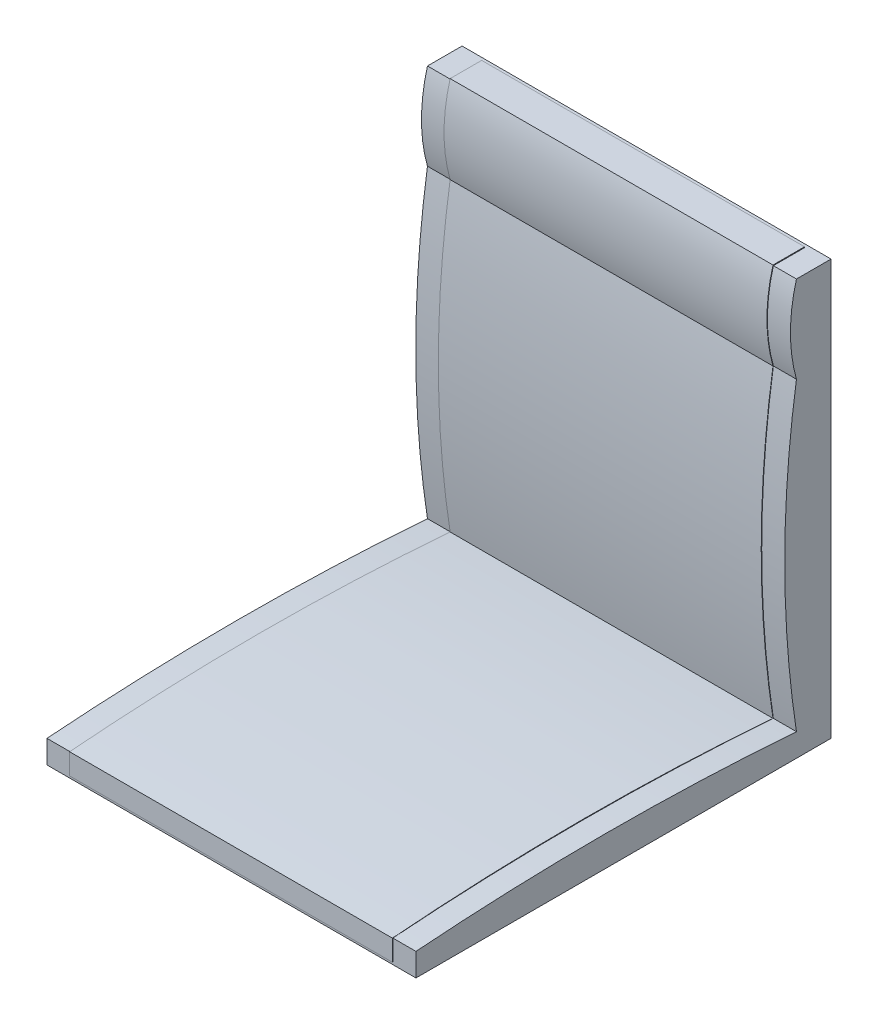
ISO-10303-21;
HEADER;
FILE_DESCRIPTION(('STEP AP214'),'2;1');
FILE_NAME('part.step','',(''),(''),'','','');
FILE_SCHEMA(('AUTOMOTIVE_DESIGN { 1 0 10303 214 1 1 1 1 }'));
ENDSEC;
DATA;
#1=APPLICATION_CONTEXT('core data for automotive mechanical design processes');
#2=APPLICATION_PROTOCOL_DEFINITION('international standard','automotive_design',2000,#1);
#3=PRODUCT_CONTEXT('',#1,'mechanical');
#4=PRODUCT('Part','Part','',(#3));
#5=PRODUCT_RELATED_PRODUCT_CATEGORY('part','',(#4));
#6=PRODUCT_DEFINITION_FORMATION('','',#4);
#7=PRODUCT_DEFINITION_CONTEXT('part definition',#1,'design');
#8=PRODUCT_DEFINITION('design','',#6,#7);
#9=PRODUCT_DEFINITION_SHAPE('','',#8);
#10=(LENGTH_UNIT() NAMED_UNIT(*) SI_UNIT(.MILLI.,.METRE.));
#11=(NAMED_UNIT(*) PLANE_ANGLE_UNIT() SI_UNIT($,.RADIAN.));
#12=(NAMED_UNIT(*) SI_UNIT($,.STERADIAN.) SOLID_ANGLE_UNIT());
#13=UNCERTAINTY_MEASURE_WITH_UNIT(LENGTH_MEASURE(1.E-05),#10,'distance_accuracy_value','');
#14=(GEOMETRIC_REPRESENTATION_CONTEXT(3) GLOBAL_UNCERTAINTY_ASSIGNED_CONTEXT((#13)) GLOBAL_UNIT_ASSIGNED_CONTEXT((#10,
#11,#12)) REPRESENTATION_CONTEXT('',''));
#15=CARTESIAN_POINT('',(0.,0.,0.));
#16=DIRECTION('',(0.,0.,1.));
#17=DIRECTION('',(1.,0.,0.));
#18=AXIS2_PLACEMENT_3D('',#15,#16,#17);
#19=CARTESIAN_POINT('',(0.,406.4,0.));
#20=DIRECTION('',(0.,-1.,0.));
#21=DIRECTION('',(0.,0.,-1.));
#22=AXIS2_PLACEMENT_3D('',#19,#20,#21);
#23=PLANE('',#22);
#24=DIRECTION('',(-1.,0.,0.));
#25=VECTOR('',#24,1.);
#26=CARTESIAN_POINT('',(-203.2,406.4,-228.6));
#27=LINE('',#26,#25);
#28=CARTESIAN_POINT('',(203.2,406.4,-228.6));
#29=VERTEX_POINT('',#28);
#30=CARTESIAN_POINT('',(-203.2,406.4,-228.6));
#31=VERTEX_POINT('',#30);
#32=EDGE_CURVE('E334',#29,#31,#27,.T.);
#33=ORIENTED_EDGE('',*,*,#32,.F.);
#34=DIRECTION('',(0.,0.,-1.));
#35=VECTOR('',#34,1.);
#36=CARTESIAN_POINT('',(203.2,406.4,228.6));
#37=LINE('',#36,#35);
#38=CARTESIAN_POINT('',(203.2,406.4,228.6));
#39=VERTEX_POINT('',#38);
#40=EDGE_CURVE('E324',#39,#29,#37,.T.);
#41=ORIENTED_EDGE('',*,*,#40,.F.);
#42=DIRECTION('',(1.,0.,0.));
#43=VECTOR('',#42,1.);
#44=CARTESIAN_POINT('',(-203.2,406.4,228.6));
#45=LINE('',#44,#43);
#46=CARTESIAN_POINT('',(-203.2,406.4,228.6));
#47=VERTEX_POINT('',#46);
#48=EDGE_CURVE('E339',#47,#39,#45,.T.);
#49=ORIENTED_EDGE('',*,*,#48,.F.);
#50=DIRECTION('',(0.,0.,1.));
#51=VECTOR('',#50,1.);
#52=CARTESIAN_POINT('',(-203.2,406.4,228.6));
#53=LINE('',#52,#51);
#54=EDGE_CURVE('E337',#31,#47,#53,.T.);
#55=ORIENTED_EDGE('',*,*,#54,.F.);
#56=EDGE_LOOP('',(#33,#41,#49,#55));
#57=FACE_BOUND('',#56,.T.);
#58=DIRECTION('',(0.,0.,1.));
#59=VECTOR('',#58,1.);
#60=CARTESIAN_POINT('',(0.,406.4,0.));
#61=LINE('',#60,#59);
#62=CARTESIAN_POINT('',(0.,406.4,0.));
#63=VERTEX_POINT('',#62);
#64=CARTESIAN_POINT('',(0.,406.4,1.93196020637743));
#65=VERTEX_POINT('',#64);
#66=EDGE_CURVE('E705',#63,#65,#61,.T.);
#67=ORIENTED_EDGE('',*,*,#66,.F.);
#68=DIRECTION('',(1.,0.,0.));
#69=VECTOR('',#68,1.);
#70=CARTESIAN_POINT('',(-1.33102062761736,406.4,0.));
#71=LINE('',#70,#69);
#72=CARTESIAN_POINT('',(-1.33102062761736,406.4,0.));
#73=VERTEX_POINT('',#72);
#74=EDGE_CURVE('E216',#73,#63,#71,.T.);
#75=ORIENTED_EDGE('',*,*,#74,.F.);
#76=DIRECTION('',(-0.567338393542588,0.,-0.823484758336495));
#77=VECTOR('',#76,1.);
#78=CARTESIAN_POINT('',(0.,406.4,1.93196020637743));
#79=LINE('',#78,#77);
#80=EDGE_CURVE('E212',#65,#73,#79,.T.);
#81=ORIENTED_EDGE('',*,*,#80,.F.);
#82=EDGE_LOOP('',(#67,#75,#81));
#83=FACE_BOUND('',#82,.T.);
#84=ADVANCED_FACE('F50',(#57,#83),#23,.T.);
#85=CARTESIAN_POINT('',(-203.2,599.893069022727,-1283.6487688182));
#86=DIRECTION('',(1.,0.,0.));
#87=DIRECTION('',(0.,0.,-1.));
#88=AXIS2_PLACEMENT_3D('',#85,#86,#87);
#89=CYLINDRICAL_SURFACE('',#88,1105.99706628102);
#90=DIRECTION('',(1.,0.,0.));
#91=VECTOR('',#90,1.);
#92=CARTESIAN_POINT('',(-203.2,767.986138045453,-190.5));
#93=LINE('',#92,#91);
#94=CARTESIAN_POINT('',(177.8,767.986138045453,-190.5));
#95=VERTEX_POINT('',#94);
#96=CARTESIAN_POINT('',(203.2,767.986138045453,-190.5));
#97=VERTEX_POINT('',#96);
#98=EDGE_CURVE('E305',#95,#97,#93,.T.);
#99=ORIENTED_EDGE('',*,*,#98,.F.);
#100=CARTESIAN_POINT('',(177.8,599.893069022727,-1283.6487688182));
#101=DIRECTION('',(-1.,0.,0.));
#102=DIRECTION('',(0.,0.,1.));
#103=AXIS2_PLACEMENT_3D('',#100,#101,#102);
#104=CIRCLE('',#103,1105.99706628102);
#105=CARTESIAN_POINT('',(177.8,431.8,-190.5));
#106=VERTEX_POINT('',#105);
#107=EDGE_CURVE('E73',#95,#106,#104,.F.);
#108=ORIENTED_EDGE('',*,*,#107,.T.);
#109=DIRECTION('',(1.,0.,0.));
#110=VECTOR('',#109,1.);
#111=CARTESIAN_POINT('',(-203.2,431.8,-190.5));
#112=LINE('',#111,#110);
#113=CARTESIAN_POINT('',(203.2,431.8,-190.5));
#114=VERTEX_POINT('',#113);
#115=EDGE_CURVE('E311',#106,#114,#112,.T.);
#116=ORIENTED_EDGE('',*,*,#115,.T.);
#117=CARTESIAN_POINT('',(203.2,599.893069022727,-1283.6487688182));
#118=DIRECTION('',(1.,0.,0.));
#119=DIRECTION('',(0.,0.,-1.));
#120=AXIS2_PLACEMENT_3D('',#117,#118,#119);
#121=CIRCLE('',#120,1105.99706628102);
#122=EDGE_CURVE('E299',#97,#114,#121,.T.);
#123=ORIENTED_EDGE('',*,*,#122,.F.);
#124=EDGE_LOOP('',(#99,#108,#116,#123));
#125=FACE_BOUND('',#124,.T.);
#126=ADVANCED_FACE('F381',(#125),#89,.T.);
#127=CARTESIAN_POINT('',(-203.2,-2322.38845195721,19.0500000000001));
#128=DIRECTION('',(1.,0.,0.));
#129=DIRECTION('',(0.,0.,-1.));
#130=AXIS2_PLACEMENT_3D('',#127,#128,#129);
#131=CYLINDRICAL_SURFACE('',#130,2762.1486620735);
#132=ORIENTED_EDGE('',*,*,#115,.F.);
#133=CARTESIAN_POINT('',(177.8,-2322.38845195721,19.0500000000001));
#134=DIRECTION('',(-1.,0.,0.));
#135=DIRECTION('',(0.,0.,1.));
#136=AXIS2_PLACEMENT_3D('',#133,#134,#135);
#137=CIRCLE('',#136,2762.1486620735);
#138=CARTESIAN_POINT('',(177.8,431.8,228.6));
#139=VERTEX_POINT('',#138);
#140=EDGE_CURVE('E276',#106,#139,#137,.F.);
#141=ORIENTED_EDGE('',*,*,#140,.T.);
#142=DIRECTION('',(1.,0.,0.));
#143=VECTOR('',#142,1.);
#144=CARTESIAN_POINT('',(-203.2,431.8,228.6));
#145=LINE('',#144,#143);
#146=CARTESIAN_POINT('',(203.2,431.8,228.6));
#147=VERTEX_POINT('',#146);
#148=EDGE_CURVE('E331',#139,#147,#145,.T.);
#149=ORIENTED_EDGE('',*,*,#148,.T.);
#150=CARTESIAN_POINT('',(203.2,-2322.38845195721,19.0500000000001));
#151=DIRECTION('',(1.,0.,0.));
#152=DIRECTION('',(0.,0.,1.));
#153=AXIS2_PLACEMENT_3D('',#150,#151,#152);
#154=CIRCLE('',#153,2762.1486620735);
#155=EDGE_CURVE('E294',#114,#147,#154,.T.);
#156=ORIENTED_EDGE('',*,*,#155,.F.);
#157=EDGE_LOOP('',(#132,#141,#149,#156));
#158=FACE_BOUND('',#157,.T.);
#159=ADVANCED_FACE('F446',(#158),#131,.T.);
#160=CARTESIAN_POINT('',(-203.2,815.793069022726,-360.231275794569));
#161=DIRECTION('',(1.,0.,0.));
#162=DIRECTION('',(0.,0.,-1.));
#163=AXIS2_PLACEMENT_3D('',#160,#161,#162);
#164=CYLINDRICAL_SURFACE('',#163,176.335500204349);
#165=DIRECTION('',(1.,0.,0.));
#166=VECTOR('',#165,1.);
#167=CARTESIAN_POINT('',(-203.2,863.6,-190.5));
#168=LINE('',#167,#166);
#169=CARTESIAN_POINT('',(177.8,863.6,-190.5));
#170=VERTEX_POINT('',#169);
#171=CARTESIAN_POINT('',(203.2,863.6,-190.5));
#172=VERTEX_POINT('',#171);
#173=EDGE_CURVE('E314',#170,#172,#168,.T.);
#174=ORIENTED_EDGE('',*,*,#173,.F.);
#175=CARTESIAN_POINT('',(177.8,815.793069022726,-360.231275794569));
#176=DIRECTION('',(-1.,0.,0.));
#177=DIRECTION('',(0.,0.,1.));
#178=AXIS2_PLACEMENT_3D('',#175,#176,#177);
#179=CIRCLE('',#178,176.335500204349);
#180=EDGE_CURVE('E350',#170,#95,#179,.F.);
#181=ORIENTED_EDGE('',*,*,#180,.T.);
#182=ORIENTED_EDGE('',*,*,#98,.T.);
#183=CARTESIAN_POINT('',(203.2,815.793069022726,-360.231275794569));
#184=DIRECTION('',(1.,0.,0.));
#185=DIRECTION('',(0.,0.,1.));
#186=AXIS2_PLACEMENT_3D('',#183,#184,#185);
#187=CIRCLE('',#186,176.335500204349);
#188=EDGE_CURVE('E290',#172,#97,#187,.T.);
#189=ORIENTED_EDGE('',*,*,#188,.F.);
#190=EDGE_LOOP('',(#174,#181,#182,#189));
#191=FACE_BOUND('',#190,.T.);
#192=ADVANCED_FACE('F377',(#191),#164,.T.);
#193=CARTESIAN_POINT('',(203.2,431.8,228.6));
#194=DIRECTION('',(-1.,0.,0.));
#195=DIRECTION('',(0.,0.,1.));
#196=AXIS2_PLACEMENT_3D('',#193,#194,#195);
#197=PLANE('',#196);
#198=ORIENTED_EDGE('',*,*,#40,.T.);
#199=DIRECTION('',(0.,-1.,0.));
#200=VECTOR('',#199,1.);
#201=CARTESIAN_POINT('',(203.2,431.8,-228.6));
#202=LINE('',#201,#200);
#203=CARTESIAN_POINT('',(203.2,863.6,-228.6));
#204=VERTEX_POINT('',#203);
#205=EDGE_CURVE('E348',#204,#29,#202,.T.);
#206=ORIENTED_EDGE('',*,*,#205,.F.);
#207=DIRECTION('',(0.,0.,-1.));
#208=VECTOR('',#207,1.);
#209=CARTESIAN_POINT('',(203.2,863.6,-228.6));
#210=LINE('',#209,#208);
#211=EDGE_CURVE('E319',#172,#204,#210,.T.);
#212=ORIENTED_EDGE('',*,*,#211,.F.);
#213=ORIENTED_EDGE('',*,*,#188,.T.);
#214=ORIENTED_EDGE('',*,*,#122,.T.);
#215=ORIENTED_EDGE('',*,*,#155,.T.);
#216=DIRECTION('',(0.,-1.,0.));
#217=VECTOR('',#216,1.);
#218=CARTESIAN_POINT('',(203.2,431.8,228.6));
#219=LINE('',#218,#217);
#220=EDGE_CURVE('E330',#147,#39,#219,.T.);
#221=ORIENTED_EDGE('',*,*,#220,.T.);
#222=EDGE_LOOP('',(#198,#206,#212,#213,#214,#215,#221));
#223=FACE_BOUND('',#222,.T.);
#224=ADVANCED_FACE('F52',(#223),#197,.F.);
#225=CARTESIAN_POINT('',(-203.2,431.8,-228.6));
#226=DIRECTION('',(0.,0.,1.));
#227=DIRECTION('',(1.,0.,0.));
#228=AXIS2_PLACEMENT_3D('',#225,#226,#227);
#229=PLANE('',#228);
#230=ORIENTED_EDGE('',*,*,#32,.T.);
#231=DIRECTION('',(0.,-1.,0.));
#232=VECTOR('',#231,1.);
#233=CARTESIAN_POINT('',(-203.2,431.8,-228.6));
#234=LINE('',#233,#232);
#235=CARTESIAN_POINT('',(-203.2,863.6,-228.6));
#236=VERTEX_POINT('',#235);
#237=EDGE_CURVE('E346',#236,#31,#234,.T.);
#238=ORIENTED_EDGE('',*,*,#237,.F.);
#239=DIRECTION('',(-1.,0.,0.));
#240=VECTOR('',#239,1.);
#241=CARTESIAN_POINT('',(-203.2,863.6,-228.6));
#242=LINE('',#241,#240);
#243=EDGE_CURVE('E321',#204,#236,#242,.T.);
#244=ORIENTED_EDGE('',*,*,#243,.F.);
#245=ORIENTED_EDGE('',*,*,#205,.T.);
#246=EDGE_LOOP('',(#230,#238,#244,#245));
#247=FACE_BOUND('',#246,.T.);
#248=ADVANCED_FACE('F455',(#247),#229,.F.);
#249=CARTESIAN_POINT('',(-203.2,431.8,228.6));
#250=DIRECTION('',(1.,0.,0.));
#251=DIRECTION('',(0.,0.,-1.));
#252=AXIS2_PLACEMENT_3D('',#249,#250,#251);
#253=PLANE('',#252);
#254=CARTESIAN_POINT('',(-203.2,599.893069022727,-1283.6487688182));
#255=DIRECTION('',(1.,0.,0.));
#256=DIRECTION('',(0.,0.,-1.));
#257=AXIS2_PLACEMENT_3D('',#254,#255,#256);
#258=CIRCLE('',#257,1105.99706628102);
#259=CARTESIAN_POINT('',(-203.2,767.986138045453,-190.5));
#260=VERTEX_POINT('',#259);
#261=CARTESIAN_POINT('',(-203.2,431.8,-190.5));
#262=VERTEX_POINT('',#261);
#263=EDGE_CURVE('E302',#260,#262,#258,.T.);
#264=ORIENTED_EDGE('',*,*,#263,.F.);
#265=CARTESIAN_POINT('',(-203.2,815.793069022726,-360.231275794569));
#266=DIRECTION('',(1.,0.,0.));
#267=DIRECTION('',(0.,0.,1.));
#268=AXIS2_PLACEMENT_3D('',#265,#266,#267);
#269=CIRCLE('',#268,176.335500204349);
#270=CARTESIAN_POINT('',(-203.2,863.6,-190.5));
#271=VERTEX_POINT('',#270);
#272=EDGE_CURVE('E291',#271,#260,#269,.T.);
#273=ORIENTED_EDGE('',*,*,#272,.F.);
#274=DIRECTION('',(0.,0.,1.));
#275=VECTOR('',#274,1.);
#276=CARTESIAN_POINT('',(-203.2,863.6,-228.6));
#277=LINE('',#276,#275);
#278=EDGE_CURVE('E312',#236,#271,#277,.T.);
#279=ORIENTED_EDGE('',*,*,#278,.F.);
#280=ORIENTED_EDGE('',*,*,#237,.T.);
#281=ORIENTED_EDGE('',*,*,#54,.T.);
#282=DIRECTION('',(0.,-1.,0.));
#283=VECTOR('',#282,1.);
#284=CARTESIAN_POINT('',(-203.2,431.8,228.6));
#285=LINE('',#284,#283);
#286=CARTESIAN_POINT('',(-203.2,431.8,228.6));
#287=VERTEX_POINT('',#286);
#288=EDGE_CURVE('E343',#287,#47,#285,.T.);
#289=ORIENTED_EDGE('',*,*,#288,.F.);
#290=CARTESIAN_POINT('',(-203.2,-2322.38845195721,19.0500000000001));
#291=DIRECTION('',(1.,0.,0.));
#292=DIRECTION('',(0.,0.,1.));
#293=AXIS2_PLACEMENT_3D('',#290,#291,#292);
#294=CIRCLE('',#293,2762.1486620735);
#295=EDGE_CURVE('E297',#262,#287,#294,.T.);
#296=ORIENTED_EDGE('',*,*,#295,.F.);
#297=EDGE_LOOP('',(#264,#273,#279,#280,#281,#289,#296));
#298=FACE_BOUND('',#297,.T.);
#299=ADVANCED_FACE('F394',(#298),#253,.F.);
#300=CARTESIAN_POINT('',(-203.2,431.8,228.6));
#301=DIRECTION('',(0.,0.,-1.));
#302=DIRECTION('',(-1.,0.,0.));
#303=AXIS2_PLACEMENT_3D('',#300,#301,#302);
#304=PLANE('',#303);
#305=DIRECTION('',(1.,0.,0.));
#306=VECTOR('',#305,1.);
#307=CARTESIAN_POINT('',(-203.2,408.976479820344,228.6));
#308=LINE('',#307,#306);
#309=CARTESIAN_POINT('',(-177.8,408.976479820344,228.6));
#310=VERTEX_POINT('',#309);
#311=CARTESIAN_POINT('',(177.8,408.976479820344,228.6));
#312=VERTEX_POINT('',#311);
#313=EDGE_CURVE('E13',#310,#312,#308,.T.);
#314=ORIENTED_EDGE('',*,*,#313,.F.);
#315=DIRECTION('',(0.,1.,0.));
#316=VECTOR('',#315,1.);
#317=CARTESIAN_POINT('',(-177.8,431.8,228.6));
#318=LINE('',#317,#316);
#319=CARTESIAN_POINT('',(-177.8,431.8,228.6));
#320=VERTEX_POINT('',#319);
#321=EDGE_CURVE('E287',#310,#320,#318,.T.);
#322=ORIENTED_EDGE('',*,*,#321,.T.);
#323=EDGE_CURVE('E327',#287,#320,#145,.T.);
#324=ORIENTED_EDGE('',*,*,#323,.F.);
#325=ORIENTED_EDGE('',*,*,#288,.T.);
#326=ORIENTED_EDGE('',*,*,#48,.T.);
#327=ORIENTED_EDGE('',*,*,#220,.F.);
#328=ORIENTED_EDGE('',*,*,#148,.F.);
#329=DIRECTION('',(0.,1.,0.));
#330=VECTOR('',#329,1.);
#331=CARTESIAN_POINT('',(177.8,431.8,228.6));
#332=LINE('',#331,#330);
#333=EDGE_CURVE('E279',#312,#139,#332,.T.);
#334=ORIENTED_EDGE('',*,*,#333,.F.);
#335=EDGE_LOOP('',(#314,#322,#324,#325,#326,#327,#328,#334));
#336=FACE_BOUND('',#335,.T.);
#337=ADVANCED_FACE('F410',(#336),#304,.F.);
#338=CARTESIAN_POINT('',(0.,863.6,0.));
#339=DIRECTION('',(0.,1.,0.));
#340=DIRECTION('',(0.,0.,1.));
#341=AXIS2_PLACEMENT_3D('',#338,#339,#340);
#342=PLANE('',#341);
#343=DIRECTION('',(0.,0.,1.));
#344=VECTOR('',#343,1.);
#345=CARTESIAN_POINT('',(-177.8,863.6,0.));
#346=LINE('',#345,#344);
#347=CARTESIAN_POINT('',(-177.8,863.6,-224.793246744636));
#348=VERTEX_POINT('',#347);
#349=CARTESIAN_POINT('',(-177.8,863.6,-190.5));
#350=VERTEX_POINT('',#349);
#351=EDGE_CURVE('E283',#348,#350,#346,.T.);
#352=ORIENTED_EDGE('',*,*,#351,.F.);
#353=DIRECTION('',(1.,0.,0.));
#354=VECTOR('',#353,1.);
#355=CARTESIAN_POINT('',(0.,863.6,-224.793246744636));
#356=LINE('',#355,#354);
#357=CARTESIAN_POINT('',(177.8,863.6,-224.793246744636));
#358=VERTEX_POINT('',#357);
#359=EDGE_CURVE('E58',#348,#358,#356,.T.);
#360=ORIENTED_EDGE('',*,*,#359,.T.);
#361=DIRECTION('',(0.,0.,1.));
#362=VECTOR('',#361,1.);
#363=CARTESIAN_POINT('',(177.8,863.6,0.));
#364=LINE('',#363,#362);
#365=EDGE_CURVE('E273',#358,#170,#364,.T.);
#366=ORIENTED_EDGE('',*,*,#365,.T.);
#367=ORIENTED_EDGE('',*,*,#173,.T.);
#368=ORIENTED_EDGE('',*,*,#211,.T.);
#369=ORIENTED_EDGE('',*,*,#243,.T.);
#370=ORIENTED_EDGE('',*,*,#278,.T.);
#371=EDGE_CURVE('E316',#271,#350,#168,.T.);
#372=ORIENTED_EDGE('',*,*,#371,.T.);
#373=EDGE_LOOP('',(#352,#360,#366,#367,#368,#369,#370,#372));
#374=FACE_BOUND('',#373,.T.);
#375=ADVANCED_FACE('F356',(#374),#342,.T.);
#376=CARTESIAN_POINT('',(-177.8,599.893069022727,-1283.6487688182));
#377=DIRECTION('',(-1.,0.,0.));
#378=DIRECTION('',(0.,0.,1.));
#379=AXIS2_PLACEMENT_3D('',#376,#377,#378);
#380=CIRCLE('',#379,1105.99706628102);
#381=CARTESIAN_POINT('',(-177.8,767.986138045453,-190.5));
#382=VERTEX_POINT('',#381);
#383=CARTESIAN_POINT('',(-177.8,431.8,-190.5));
#384=VERTEX_POINT('',#383);
#385=EDGE_CURVE('E281',#382,#384,#380,.F.);
#386=ORIENTED_EDGE('',*,*,#385,.F.);
#387=EDGE_CURVE('E308',#260,#382,#93,.T.);
#388=ORIENTED_EDGE('',*,*,#387,.F.);
#389=ORIENTED_EDGE('',*,*,#263,.T.);
#390=EDGE_CURVE('E315',#262,#384,#112,.T.);
#391=ORIENTED_EDGE('',*,*,#390,.T.);
#392=EDGE_LOOP('',(#386,#388,#389,#391));
#393=FACE_BOUND('',#392,.T.);
#394=ADVANCED_FACE('F401',(#393),#89,.T.);
#395=CARTESIAN_POINT('',(-177.8,-2322.38845195721,19.0500000000001));
#396=DIRECTION('',(-1.,0.,0.));
#397=DIRECTION('',(0.,0.,1.));
#398=AXIS2_PLACEMENT_3D('',#395,#396,#397);
#399=CIRCLE('',#398,2762.1486620735);
#400=EDGE_CURVE('E285',#384,#320,#399,.F.);
#401=ORIENTED_EDGE('',*,*,#400,.F.);
#402=ORIENTED_EDGE('',*,*,#390,.F.);
#403=ORIENTED_EDGE('',*,*,#295,.T.);
#404=ORIENTED_EDGE('',*,*,#323,.T.);
#405=EDGE_LOOP('',(#401,#402,#403,#404));
#406=FACE_BOUND('',#405,.T.);
#407=ADVANCED_FACE('F403',(#406),#131,.T.);
#408=CARTESIAN_POINT('',(-177.8,815.793069022726,-360.231275794569));
#409=DIRECTION('',(-1.,0.,0.));
#410=DIRECTION('',(0.,0.,1.));
#411=AXIS2_PLACEMENT_3D('',#408,#409,#410);
#412=CIRCLE('',#411,176.335500204349);
#413=EDGE_CURVE('E352',#350,#382,#412,.F.);
#414=ORIENTED_EDGE('',*,*,#413,.F.);
#415=ORIENTED_EDGE('',*,*,#371,.F.);
#416=ORIENTED_EDGE('',*,*,#272,.T.);
#417=ORIENTED_EDGE('',*,*,#387,.T.);
#418=EDGE_LOOP('',(#414,#415,#416,#417));
#419=FACE_BOUND('',#418,.T.);
#420=ADVANCED_FACE('F397',(#419),#164,.T.);
#421=CARTESIAN_POINT('',(-177.8,408.976479820344,-224.793246744636));
#422=DIRECTION('',(0.,1.,0.));
#423=DIRECTION('',(0.,0.,1.));
#424=AXIS2_PLACEMENT_3D('',#421,#422,#423);
#425=PLANE('',#424);
#426=DIRECTION('',(0.,0.,1.));
#427=VECTOR('',#426,1.);
#428=CARTESIAN_POINT('',(-177.8,408.976479820344,-224.793246744636));
#429=LINE('',#428,#427);
#430=CARTESIAN_POINT('',(-177.8,408.976479820344,229.126005902308));
#431=VERTEX_POINT('',#430);
#432=EDGE_CURVE('E230',#310,#431,#429,.T.);
#433=ORIENTED_EDGE('',*,*,#432,.F.);
#434=ORIENTED_EDGE('',*,*,#313,.T.);
#435=DIRECTION('',(0.,0.,1.));
#436=VECTOR('',#435,1.);
#437=CARTESIAN_POINT('',(177.8,408.976479820344,-224.793246744636));
#438=LINE('',#437,#436);
#439=CARTESIAN_POINT('',(177.8,408.976479820344,229.126005902308));
#440=VERTEX_POINT('',#439);
#441=EDGE_CURVE('E221',#312,#440,#438,.T.);
#442=ORIENTED_EDGE('',*,*,#441,.T.);
#443=DIRECTION('',(1.,0.,0.));
#444=VECTOR('',#443,1.);
#445=CARTESIAN_POINT('',(-177.8,408.976479820344,229.126005902308));
#446=LINE('',#445,#444);
#447=EDGE_CURVE('E269',#431,#440,#446,.T.);
#448=ORIENTED_EDGE('',*,*,#447,.F.);
#449=EDGE_LOOP('',(#433,#434,#442,#448));
#450=FACE_BOUND('',#449,.T.);
#451=ADVANCED_FACE('F415',(#450),#425,.F.);
#452=CARTESIAN_POINT('',(-177.8,-2169.09699587393,19.5307423923426));
#453=DIRECTION('',(-1.,0.,0.));
#454=DIRECTION('',(0.,0.,1.));
#455=AXIS2_PLACEMENT_3D('',#452,#453,#454);
#456=PLANE('',#455);
#457=ORIENTED_EDGE('',*,*,#321,.F.);
#458=ORIENTED_EDGE('',*,*,#432,.T.);
#459=DIRECTION('',(0.,1.,0.));
#460=VECTOR('',#459,1.);
#461=CARTESIAN_POINT('',(-177.8,408.976479820344,229.126005902308));
#462=LINE('',#461,#460);
#463=CARTESIAN_POINT('',(-177.8,432.005066031621,229.126005902308));
#464=VERTEX_POINT('',#463);
#465=EDGE_CURVE('E233',#431,#464,#462,.T.);
#466=ORIENTED_EDGE('',*,*,#465,.T.);
#467=CARTESIAN_POINT('',(-177.8,-2169.09699587393,19.5307423923426));
#468=DIRECTION('',(-1.,0.,0.));
#469=DIRECTION('',(0.,0.,1.));
#470=AXIS2_PLACEMENT_3D('',#467,#468,#469);
#471=CIRCLE('',#470,2609.53292965142);
#472=CARTESIAN_POINT('',(-177.8,432.005066031621,-190.064521117623));
#473=VERTEX_POINT('',#472);
#474=EDGE_CURVE('E235',#464,#473,#471,.T.);
#475=ORIENTED_EDGE('',*,*,#474,.T.);
#476=CARTESIAN_POINT('',(-177.8,600.056508720752,-1271.92044683431));
#477=DIRECTION('',(-1.,0.,0.));
#478=DIRECTION('',(0.,0.,1.));
#479=AXIS2_PLACEMENT_3D('',#476,#477,#478);
#480=CIRCLE('',#479,1094.83036649438);
#481=CARTESIAN_POINT('',(-177.8,768.107951409883,-190.064521117623));
#482=VERTEX_POINT('',#481);
#483=EDGE_CURVE('E237',#473,#482,#480,.T.);
#484=ORIENTED_EDGE('',*,*,#483,.T.);
#485=CARTESIAN_POINT('',(-177.8,816.295948050964,-360.239749299661));
#486=DIRECTION('',(-1.,0.,0.));
#487=DIRECTION('',(0.,0.,1.));
#488=AXIS2_PLACEMENT_3D('',#485,#486,#487);
#489=CIRCLE('',#488,176.866309135147);
#490=CARTESIAN_POINT('',(-177.8,864.483944692044,-190.064521117623));
#491=VERTEX_POINT('',#490);
#492=EDGE_CURVE('E239',#482,#491,#489,.T.);
#493=ORIENTED_EDGE('',*,*,#492,.T.);
#494=DIRECTION('',(0.,0.,-1.));
#495=VECTOR('',#494,1.);
#496=CARTESIAN_POINT('',(-177.8,864.483944692044,-190.064521117623));
#497=LINE('',#496,#495);
#498=CARTESIAN_POINT('',(-177.8,864.483944692044,-224.793246744636));
#499=VERTEX_POINT('',#498);
#500=EDGE_CURVE('E241',#491,#499,#497,.T.);
#501=ORIENTED_EDGE('',*,*,#500,.T.);
#502=DIRECTION('',(0.,-1.,0.));
#503=VECTOR('',#502,1.);
#504=CARTESIAN_POINT('',(-177.8,864.483944692044,-224.793246744636));
#505=LINE('',#504,#503);
#506=EDGE_CURVE('E227',#499,#348,#505,.T.);
#507=ORIENTED_EDGE('',*,*,#506,.T.);
#508=ORIENTED_EDGE('',*,*,#351,.T.);
#509=ORIENTED_EDGE('',*,*,#413,.T.);
#510=ORIENTED_EDGE('',*,*,#385,.T.);
#511=ORIENTED_EDGE('',*,*,#400,.T.);
#512=EDGE_LOOP('',(#457,#458,#466,#475,#484,#493,#501,#507,#508,#509,#510,#511));
#513=FACE_BOUND('',#512,.T.);
#514=ADVANCED_FACE('F362',(#513),#456,.T.);
#515=CARTESIAN_POINT('',(177.8,-2169.09699587393,19.5307423923426));
#516=DIRECTION('',(-1.,0.,0.));
#517=DIRECTION('',(0.,0.,1.));
#518=AXIS2_PLACEMENT_3D('',#515,#516,#517);
#519=PLANE('',#518);
#520=ORIENTED_EDGE('',*,*,#441,.F.);
#521=ORIENTED_EDGE('',*,*,#333,.T.);
#522=ORIENTED_EDGE('',*,*,#140,.F.);
#523=ORIENTED_EDGE('',*,*,#107,.F.);
#524=ORIENTED_EDGE('',*,*,#180,.F.);
#525=ORIENTED_EDGE('',*,*,#365,.F.);
#526=DIRECTION('',(0.,-1.,0.));
#527=VECTOR('',#526,1.);
#528=CARTESIAN_POINT('',(177.8,863.6,-224.793246744636));
#529=LINE('',#528,#527);
#530=CARTESIAN_POINT('',(177.8,864.483944692044,-224.793246744636));
#531=VERTEX_POINT('',#530);
#532=EDGE_CURVE('E218',#531,#358,#529,.T.);
#533=ORIENTED_EDGE('',*,*,#532,.F.);
#534=DIRECTION('',(0.,0.,-1.));
#535=VECTOR('',#534,1.);
#536=CARTESIAN_POINT('',(177.8,864.483944692044,-190.064521117623));
#537=LINE('',#536,#535);
#538=CARTESIAN_POINT('',(177.8,864.483944692044,-190.064521117623));
#539=VERTEX_POINT('',#538);
#540=EDGE_CURVE('E231',#539,#531,#537,.T.);
#541=ORIENTED_EDGE('',*,*,#540,.F.);
#542=CARTESIAN_POINT('',(177.8,816.295948050964,-360.239749299661));
#543=DIRECTION('',(-1.,0.,0.));
#544=DIRECTION('',(0.,0.,1.));
#545=AXIS2_PLACEMENT_3D('',#542,#543,#544);
#546=CIRCLE('',#545,176.866309135147);
#547=CARTESIAN_POINT('',(177.8,768.107951409883,-190.064521117623));
#548=VERTEX_POINT('',#547);
#549=EDGE_CURVE('E251',#548,#539,#546,.T.);
#550=ORIENTED_EDGE('',*,*,#549,.F.);
#551=CARTESIAN_POINT('',(177.8,600.056508720752,-1271.92044683431));
#552=DIRECTION('',(-1.,0.,0.));
#553=DIRECTION('',(0.,0.,1.));
#554=AXIS2_PLACEMENT_3D('',#551,#552,#553);
#555=CIRCLE('',#554,1094.83036649438);
#556=CARTESIAN_POINT('',(177.8,432.005066031621,-190.064521117623));
#557=VERTEX_POINT('',#556);
#558=EDGE_CURVE('E249',#557,#548,#555,.T.);
#559=ORIENTED_EDGE('',*,*,#558,.F.);
#560=CARTESIAN_POINT('',(177.8,-2169.09699587393,19.5307423923426));
#561=DIRECTION('',(-1.,0.,0.));
#562=DIRECTION('',(0.,0.,1.));
#563=AXIS2_PLACEMENT_3D('',#560,#561,#562);
#564=CIRCLE('',#563,2609.53292965142);
#565=CARTESIAN_POINT('',(177.8,432.005066031621,229.126005902308));
#566=VERTEX_POINT('',#565);
#567=EDGE_CURVE('E247',#566,#557,#564,.T.);
#568=ORIENTED_EDGE('',*,*,#567,.F.);
#569=DIRECTION('',(0.,1.,0.));
#570=VECTOR('',#569,1.);
#571=CARTESIAN_POINT('',(177.8,408.976479820344,229.126005902308));
#572=LINE('',#571,#570);
#573=EDGE_CURVE('E245',#440,#566,#572,.T.);
#574=ORIENTED_EDGE('',*,*,#573,.F.);
#575=EDGE_LOOP('',(#520,#521,#522,#523,#524,#525,#533,#541,#550,#559,#568,#574));
#576=FACE_BOUND('',#575,.T.);
#577=ADVANCED_FACE('F373',(#576),#519,.F.);
#578=CARTESIAN_POINT('',(-177.8,863.6,-224.793246744636));
#579=DIRECTION('',(0.,0.,1.));
#580=DIRECTION('',(1.,0.,0.));
#581=AXIS2_PLACEMENT_3D('',#578,#579,#580);
#582=PLANE('',#581);
#583=ORIENTED_EDGE('',*,*,#359,.F.);
#584=ORIENTED_EDGE('',*,*,#506,.F.);
#585=DIRECTION('',(1.,0.,0.));
#586=VECTOR('',#585,1.);
#587=CARTESIAN_POINT('',(-177.8,864.483944692044,-224.793246744636));
#588=LINE('',#587,#586);
#589=EDGE_CURVE('E242',#499,#531,#588,.T.);
#590=ORIENTED_EDGE('',*,*,#589,.T.);
#591=ORIENTED_EDGE('',*,*,#532,.T.);
#592=EDGE_LOOP('',(#583,#584,#590,#591));
#593=FACE_BOUND('',#592,.T.);
#594=ADVANCED_FACE('F360',(#593),#582,.F.);
#595=CARTESIAN_POINT('',(-177.8,408.976479820344,229.126005902308));
#596=DIRECTION('',(0.,0.,-1.));
#597=DIRECTION('',(-1.,0.,0.));
#598=AXIS2_PLACEMENT_3D('',#595,#596,#597);
#599=PLANE('',#598);
#600=ORIENTED_EDGE('',*,*,#573,.T.);
#601=DIRECTION('',(1.,0.,0.));
#602=VECTOR('',#601,1.);
#603=CARTESIAN_POINT('',(-177.8,432.005066031621,229.126005902308));
#604=LINE('',#603,#602);
#605=EDGE_CURVE('E266',#464,#566,#604,.T.);
#606=ORIENTED_EDGE('',*,*,#605,.F.);
#607=ORIENTED_EDGE('',*,*,#465,.F.);
#608=ORIENTED_EDGE('',*,*,#447,.T.);
#609=EDGE_LOOP('',(#600,#606,#607,#608));
#610=FACE_BOUND('',#609,.T.);
#611=ADVANCED_FACE('F420',(#610),#599,.F.);
#612=CARTESIAN_POINT('',(-177.8,-2169.09699587393,19.5307423923426));
#613=DIRECTION('',(1.,0.,0.));
#614=DIRECTION('',(0.,0.,-1.));
#615=AXIS2_PLACEMENT_3D('',#612,#613,#614);
#616=CYLINDRICAL_SURFACE('',#615,2609.53292965142);
#617=ORIENTED_EDGE('',*,*,#567,.T.);
#618=DIRECTION('',(1.,0.,0.));
#619=VECTOR('',#618,1.);
#620=CARTESIAN_POINT('',(-177.8,432.005066031621,-190.064521117623));
#621=LINE('',#620,#619);
#622=EDGE_CURVE('E263',#473,#557,#621,.T.);
#623=ORIENTED_EDGE('',*,*,#622,.F.);
#624=ORIENTED_EDGE('',*,*,#474,.F.);
#625=ORIENTED_EDGE('',*,*,#605,.T.);
#626=EDGE_LOOP('',(#617,#623,#624,#625));
#627=FACE_BOUND('',#626,.T.);
#628=ADVANCED_FACE('F426',(#627),#616,.T.);
#629=CARTESIAN_POINT('',(-177.8,600.056508720752,-1271.92044683431));
#630=DIRECTION('',(1.,0.,0.));
#631=DIRECTION('',(0.,0.,-1.));
#632=AXIS2_PLACEMENT_3D('',#629,#630,#631);
#633=CYLINDRICAL_SURFACE('',#632,1094.83036649438);
#634=ORIENTED_EDGE('',*,*,#558,.T.);
#635=DIRECTION('',(1.,0.,0.));
#636=VECTOR('',#635,1.);
#637=CARTESIAN_POINT('',(-177.8,768.107951409883,-190.064521117623));
#638=LINE('',#637,#636);
#639=EDGE_CURVE('E260',#482,#548,#638,.T.);
#640=ORIENTED_EDGE('',*,*,#639,.F.);
#641=ORIENTED_EDGE('',*,*,#483,.F.);
#642=ORIENTED_EDGE('',*,*,#622,.T.);
#643=EDGE_LOOP('',(#634,#640,#641,#642));
#644=FACE_BOUND('',#643,.T.);
#645=ADVANCED_FACE('F429',(#644),#633,.T.);
#646=CARTESIAN_POINT('',(-177.8,816.295948050964,-360.239749299661));
#647=DIRECTION('',(1.,0.,0.));
#648=DIRECTION('',(0.,0.,-1.));
#649=AXIS2_PLACEMENT_3D('',#646,#647,#648);
#650=CYLINDRICAL_SURFACE('',#649,176.866309135147);
#651=ORIENTED_EDGE('',*,*,#549,.T.);
#652=DIRECTION('',(1.,0.,0.));
#653=VECTOR('',#652,1.);
#654=CARTESIAN_POINT('',(-177.8,864.483944692044,-190.064521117623));
#655=LINE('',#654,#653);
#656=EDGE_CURVE('E257',#491,#539,#655,.T.);
#657=ORIENTED_EDGE('',*,*,#656,.F.);
#658=ORIENTED_EDGE('',*,*,#492,.F.);
#659=ORIENTED_EDGE('',*,*,#639,.T.);
#660=EDGE_LOOP('',(#651,#657,#658,#659));
#661=FACE_BOUND('',#660,.T.);
#662=ADVANCED_FACE('F431',(#661),#650,.T.);
#663=CARTESIAN_POINT('',(-177.8,864.483944692044,-190.064521117623));
#664=DIRECTION('',(0.,-1.,0.));
#665=DIRECTION('',(0.,0.,-1.));
#666=AXIS2_PLACEMENT_3D('',#663,#664,#665);
#667=PLANE('',#666);
#668=ORIENTED_EDGE('',*,*,#540,.T.);
#669=ORIENTED_EDGE('',*,*,#589,.F.);
#670=ORIENTED_EDGE('',*,*,#500,.F.);
#671=ORIENTED_EDGE('',*,*,#656,.T.);
#672=EDGE_LOOP('',(#668,#669,#670,#671));
#673=FACE_BOUND('',#672,.T.);
#674=ADVANCED_FACE('F369',(#673),#667,.F.);
#675=CARTESIAN_POINT('',(-1.33102062761736,393.7,0.));
#676=DIRECTION('',(0.,0.,1.));
#677=DIRECTION('',(1.,0.,0.));
#678=AXIS2_PLACEMENT_3D('',#675,#676,#677);
#679=PLANE('',#678);
#680=ORIENTED_EDGE('',*,*,#74,.T.);
#681=DIRECTION('',(0.,1.,0.));
#682=VECTOR('',#681,1.);
#683=CARTESIAN_POINT('',(0.,393.7,0.));
#684=LINE('',#683,#682);
#685=CARTESIAN_POINT('',(0.,393.7,0.));
#686=VERTEX_POINT('',#685);
#687=EDGE_CURVE('E201',#686,#63,#684,.T.);
#688=ORIENTED_EDGE('',*,*,#687,.F.);
#689=DIRECTION('',(1.,0.,0.));
#690=VECTOR('',#689,1.);
#691=CARTESIAN_POINT('',(-1.33102062761736,393.7,0.));
#692=LINE('',#691,#690);
#693=CARTESIAN_POINT('',(-1.33102062761736,393.7,0.));
#694=VERTEX_POINT('',#693);
#695=EDGE_CURVE('E205',#694,#686,#692,.T.);
#696=ORIENTED_EDGE('',*,*,#695,.F.);
#697=DIRECTION('',(0.,1.,0.));
#698=VECTOR('',#697,1.);
#699=CARTESIAN_POINT('',(-1.33102062761736,393.7,0.));
#700=LINE('',#699,#698);
#701=EDGE_CURVE('E223',#694,#73,#700,.T.);
#702=ORIENTED_EDGE('',*,*,#701,.T.);
#703=EDGE_LOOP('',(#680,#688,#696,#702));
#704=FACE_BOUND('',#703,.T.);
#705=ADVANCED_FACE('F214',(#704),#679,.F.);
#706=CARTESIAN_POINT('',(0.,393.7,0.));
#707=DIRECTION('',(-1.,0.,0.));
#708=DIRECTION('',(0.,0.,1.));
#709=AXIS2_PLACEMENT_3D('',#706,#707,#708);
#710=PLANE('',#709);
#711=ORIENTED_EDGE('',*,*,#66,.T.);
#712=DIRECTION('',(0.,1.,0.));
#713=VECTOR('',#712,1.);
#714=CARTESIAN_POINT('',(0.,393.7,1.93196020637743));
#715=LINE('',#714,#713);
#716=CARTESIAN_POINT('',(0.,393.7,1.93196020637743));
#717=VERTEX_POINT('',#716);
#718=EDGE_CURVE('E65',#717,#65,#715,.T.);
#719=ORIENTED_EDGE('',*,*,#718,.F.);
#720=DIRECTION('',(0.,0.,1.));
#721=VECTOR('',#720,1.);
#722=CARTESIAN_POINT('',(0.,393.7,0.));
#723=LINE('',#722,#721);
#724=EDGE_CURVE('E197',#686,#717,#723,.T.);
#725=ORIENTED_EDGE('',*,*,#724,.F.);
#726=ORIENTED_EDGE('',*,*,#687,.T.);
#727=EDGE_LOOP('',(#711,#719,#725,#726));
#728=FACE_BOUND('',#727,.T.);
#729=ADVANCED_FACE('F199',(#728),#710,.F.);
#730=CARTESIAN_POINT('',(0.,393.7,1.93196020637743));
#731=DIRECTION('',(0.823484758336495,0.,-0.567338393542588));
#732=DIRECTION('',(-0.567338393542588,0.,-0.823484758336495));
#733=AXIS2_PLACEMENT_3D('',#730,#731,#732);
#734=PLANE('',#733);
#735=ORIENTED_EDGE('',*,*,#80,.T.);
#736=ORIENTED_EDGE('',*,*,#701,.F.);
#737=DIRECTION('',(-0.567338393542588,0.,-0.823484758336495));
#738=VECTOR('',#737,1.);
#739=CARTESIAN_POINT('',(0.,393.7,1.93196020637743));
#740=LINE('',#739,#738);
#741=EDGE_CURVE('E204',#717,#694,#740,.T.);
#742=ORIENTED_EDGE('',*,*,#741,.F.);
#743=ORIENTED_EDGE('',*,*,#718,.T.);
#744=EDGE_LOOP('',(#735,#736,#742,#743));
#745=FACE_BOUND('',#744,.T.);
#746=ADVANCED_FACE('F593',(#745),#734,.F.);
#747=CARTESIAN_POINT('',(0.,393.7,0.));
#748=DIRECTION('',(0.,-1.,0.));
#749=DIRECTION('',(0.,0.,-1.));
#750=AXIS2_PLACEMENT_3D('',#747,#748,#749);
#751=PLANE('',#750);
#752=ORIENTED_EDGE('',*,*,#695,.T.);
#753=ORIENTED_EDGE('',*,*,#724,.T.);
#754=ORIENTED_EDGE('',*,*,#741,.T.);
#755=EDGE_LOOP('',(#752,#753,#754));
#756=FACE_BOUND('',#755,.T.);
#757=ADVANCED_FACE('F208',(#756),#751,.T.);
#758=CLOSED_SHELL('',(#84,#126,#159,#192,#224,#248,#299,#337,#375,#394,#407,#420,#451,#514,#577,
#594,#611,#628,#645,#662,#674,#705,#729,#746,#757));
#759=MANIFOLD_SOLID_BREP('B2',#758);
#760=ADVANCED_BREP_SHAPE_REPRESENTATION('',(#18,#759),#14);
#761=SHAPE_DEFINITION_REPRESENTATION(#9,#760);
ENDSEC;
END-ISO-10303-21;
